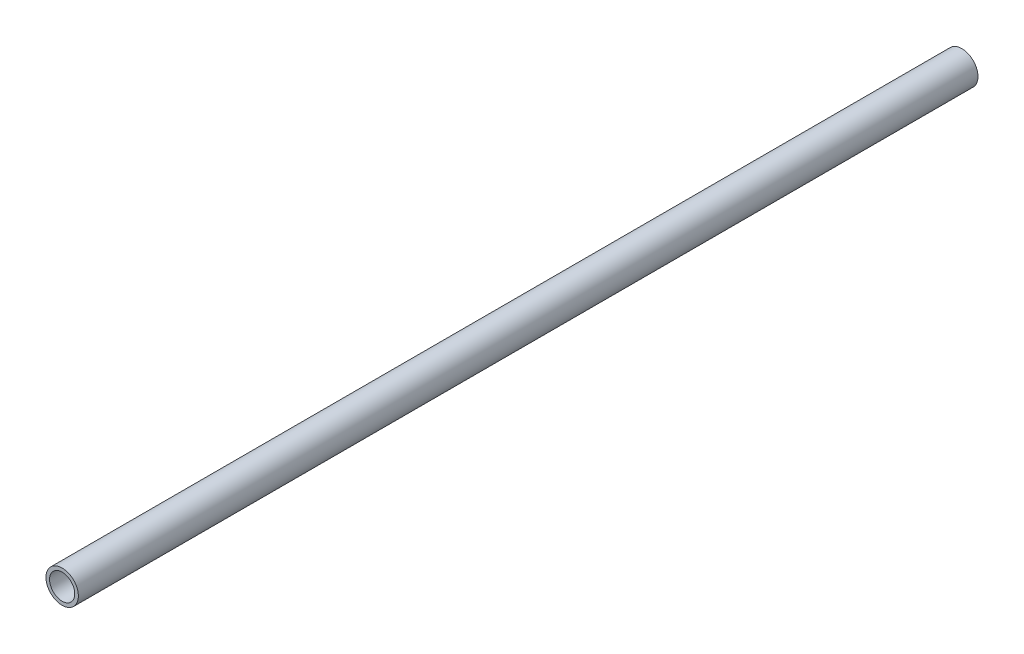
ISO-10303-21;
HEADER;
FILE_DESCRIPTION(('STEP AP214'),'2;1');
FILE_NAME('part.step','',(''),(''),'','','');
FILE_SCHEMA(('AUTOMOTIVE_DESIGN { 1 0 10303 214 1 1 1 1 }'));
ENDSEC;
DATA;
#1=APPLICATION_CONTEXT('core data for automotive mechanical design processes');
#2=APPLICATION_PROTOCOL_DEFINITION('international standard','automotive_design',2000,#1);
#3=PRODUCT_CONTEXT('',#1,'mechanical');
#4=PRODUCT('Part','Part','',(#3));
#5=PRODUCT_RELATED_PRODUCT_CATEGORY('part','',(#4));
#6=PRODUCT_DEFINITION_FORMATION('','',#4);
#7=PRODUCT_DEFINITION_CONTEXT('part definition',#1,'design');
#8=PRODUCT_DEFINITION('design','',#6,#7);
#9=PRODUCT_DEFINITION_SHAPE('','',#8);
#10=(LENGTH_UNIT() NAMED_UNIT(*) SI_UNIT(.MILLI.,.METRE.));
#11=(NAMED_UNIT(*) PLANE_ANGLE_UNIT() SI_UNIT($,.RADIAN.));
#12=(NAMED_UNIT(*) SI_UNIT($,.STERADIAN.) SOLID_ANGLE_UNIT());
#13=UNCERTAINTY_MEASURE_WITH_UNIT(LENGTH_MEASURE(1.E-05),#10,'distance_accuracy_value','');
#14=(GEOMETRIC_REPRESENTATION_CONTEXT(3) GLOBAL_UNCERTAINTY_ASSIGNED_CONTEXT((#13)) GLOBAL_UNIT_ASSIGNED_CONTEXT((#10,
#11,#12)) REPRESENTATION_CONTEXT('',''));
#15=CARTESIAN_POINT('',(0.,0.,0.));
#16=DIRECTION('',(0.,0.,1.));
#17=DIRECTION('',(1.,0.,0.));
#18=AXIS2_PLACEMENT_3D('',#15,#16,#17);
#19=CARTESIAN_POINT('',(0.,0.,150.));
#20=DIRECTION('',(0.,0.,-1.));
#21=DIRECTION('',(-1.,0.,0.));
#22=AXIS2_PLACEMENT_3D('',#19,#20,#21);
#23=CYLINDRICAL_SURFACE('',#22,4.5);
#24=CARTESIAN_POINT('',(0.,0.,-150.));
#25=DIRECTION('',(0.,0.,1.));
#26=DIRECTION('',(1.,0.,0.));
#27=AXIS2_PLACEMENT_3D('',#24,#25,#26);
#28=CIRCLE('',#27,4.5);
#29=CARTESIAN_POINT('',(4.5,0.,-150.));
#30=VERTEX_POINT('',#29);
#31=EDGE_CURVE('E10',#30,#30,#28,.T.);
#32=ORIENTED_EDGE('',*,*,#31,.T.);
#33=EDGE_LOOP('',(#32));
#34=FACE_BOUND('',#33,.T.);
#35=CARTESIAN_POINT('',(0.,0.,100.));
#36=DIRECTION('',(0.,0.,1.));
#37=DIRECTION('',(1.,0.,0.));
#38=AXIS2_PLACEMENT_3D('',#35,#36,#37);
#39=CIRCLE('',#38,4.5);
#40=CARTESIAN_POINT('',(4.5,0.,100.));
#41=VERTEX_POINT('',#40);
#42=EDGE_CURVE('E53',#41,#41,#39,.T.);
#43=ORIENTED_EDGE('',*,*,#42,.F.);
#44=EDGE_LOOP('',(#43));
#45=FACE_BOUND('',#44,.T.);
#46=ADVANCED_FACE('F40',(#34,#45),#23,.T.);
#47=CARTESIAN_POINT('',(0.,0.,150.));
#48=DIRECTION('',(0.,0.,-1.));
#49=DIRECTION('',(-1.,0.,0.));
#50=AXIS2_PLACEMENT_3D('',#47,#48,#49);
#51=CYLINDRICAL_SURFACE('',#50,3.5);
#52=CARTESIAN_POINT('',(0.,0.,-150.));
#53=DIRECTION('',(0.,0.,1.));
#54=DIRECTION('',(1.,0.,0.));
#55=AXIS2_PLACEMENT_3D('',#52,#53,#54);
#56=CIRCLE('',#55,3.5);
#57=CARTESIAN_POINT('',(3.5,0.,-150.));
#58=VERTEX_POINT('',#57);
#59=EDGE_CURVE('E47',#58,#58,#56,.T.);
#60=ORIENTED_EDGE('',*,*,#59,.F.);
#61=EDGE_LOOP('',(#60));
#62=FACE_BOUND('',#61,.T.);
#63=CARTESIAN_POINT('',(0.,0.,100.));
#64=DIRECTION('',(0.,0.,1.));
#65=DIRECTION('',(1.,0.,0.));
#66=AXIS2_PLACEMENT_3D('',#63,#64,#65);
#67=CIRCLE('',#66,3.5);
#68=CARTESIAN_POINT('',(3.5,0.,100.));
#69=VERTEX_POINT('',#68);
#70=EDGE_CURVE('E43',#69,#69,#67,.T.);
#71=ORIENTED_EDGE('',*,*,#70,.T.);
#72=EDGE_LOOP('',(#71));
#73=FACE_BOUND('',#72,.T.);
#74=ADVANCED_FACE('F60',(#62,#73),#51,.F.);
#75=CARTESIAN_POINT('',(0.,0.,-150.));
#76=DIRECTION('',(0.,0.,1.));
#77=DIRECTION('',(1.,0.,0.));
#78=AXIS2_PLACEMENT_3D('',#75,#76,#77);
#79=PLANE('',#78);
#80=ORIENTED_EDGE('',*,*,#31,.F.);
#81=EDGE_LOOP('',(#80));
#82=FACE_BOUND('',#81,.T.);
#83=ORIENTED_EDGE('',*,*,#59,.T.);
#84=EDGE_LOOP('',(#83));
#85=FACE_BOUND('',#84,.T.);
#86=ADVANCED_FACE('F64',(#82,#85),#79,.F.);
#87=CARTESIAN_POINT('',(0.,0.,100.));
#88=DIRECTION('',(0.,0.,1.));
#89=DIRECTION('',(1.,0.,0.));
#90=AXIS2_PLACEMENT_3D('',#87,#88,#89);
#91=PLANE('',#90);
#92=ORIENTED_EDGE('',*,*,#70,.F.);
#93=EDGE_LOOP('',(#92));
#94=FACE_BOUND('',#93,.T.);
#95=ORIENTED_EDGE('',*,*,#42,.T.);
#96=EDGE_LOOP('',(#95));
#97=FACE_BOUND('',#96,.T.);
#98=ADVANCED_FACE('F62',(#94,#97),#91,.T.);
#99=CLOSED_SHELL('',(#46,#74,#86,#98));
#100=MANIFOLD_SOLID_BREP('B2',#99);
#101=ADVANCED_BREP_SHAPE_REPRESENTATION('',(#18,#100),#14);
#102=SHAPE_DEFINITION_REPRESENTATION(#9,#101);
ENDSEC;
END-ISO-10303-21;
